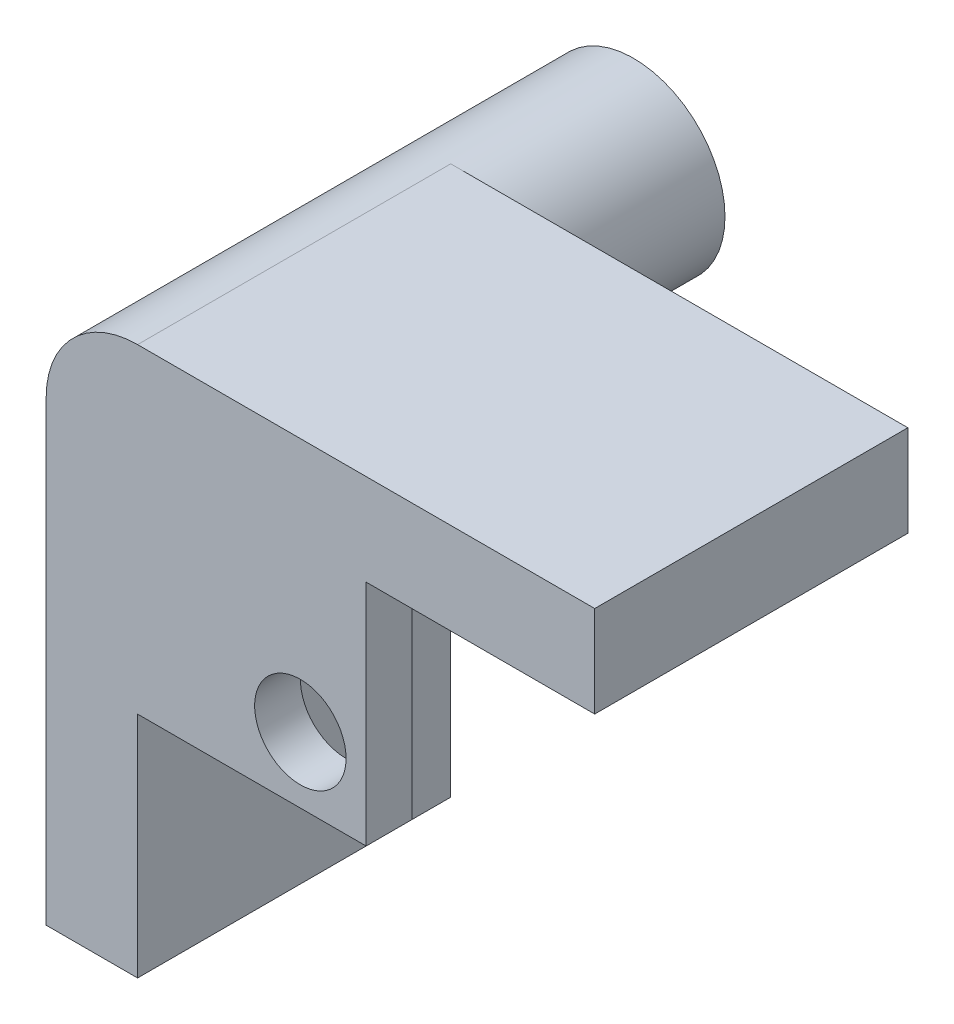
ISO-10303-21;
HEADER;
FILE_DESCRIPTION(('STEP AP214'),'2;1');
FILE_NAME('part.step','',(''),(''),'','','');
FILE_SCHEMA(('AUTOMOTIVE_DESIGN { 1 0 10303 214 1 1 1 1 }'));
ENDSEC;
DATA;
#1=APPLICATION_CONTEXT('core data for automotive mechanical design processes');
#2=APPLICATION_PROTOCOL_DEFINITION('international standard','automotive_design',2000,#1);
#3=PRODUCT_CONTEXT('',#1,'mechanical');
#4=PRODUCT('Part','Part','',(#3));
#5=PRODUCT_RELATED_PRODUCT_CATEGORY('part','',(#4));
#6=PRODUCT_DEFINITION_FORMATION('','',#4);
#7=PRODUCT_DEFINITION_CONTEXT('part definition',#1,'design');
#8=PRODUCT_DEFINITION('design','',#6,#7);
#9=PRODUCT_DEFINITION_SHAPE('','',#8);
#10=(LENGTH_UNIT() NAMED_UNIT(*) SI_UNIT(.MILLI.,.METRE.));
#11=(NAMED_UNIT(*) PLANE_ANGLE_UNIT() SI_UNIT($,.RADIAN.));
#12=(NAMED_UNIT(*) SI_UNIT($,.STERADIAN.) SOLID_ANGLE_UNIT());
#13=UNCERTAINTY_MEASURE_WITH_UNIT(LENGTH_MEASURE(1.E-05),#10,'distance_accuracy_value','');
#14=(GEOMETRIC_REPRESENTATION_CONTEXT(3) GLOBAL_UNCERTAINTY_ASSIGNED_CONTEXT((#13)) GLOBAL_UNIT_ASSIGNED_CONTEXT((#10,
#11,#12)) REPRESENTATION_CONTEXT('',''));
#15=CARTESIAN_POINT('',(0.,0.,0.));
#16=DIRECTION('',(0.,0.,1.));
#17=DIRECTION('',(1.,0.,0.));
#18=AXIS2_PLACEMENT_3D('',#15,#16,#17);
#19=CARTESIAN_POINT('',(0.,0.,0.));
#20=DIRECTION('',(0.,0.,-1.));
#21=DIRECTION('',(1.,0.,0.));
#22=AXIS2_PLACEMENT_3D('',#19,#20,#21);
#23=PLANE('',#22);
#24=CARTESIAN_POINT('',(-46.,-4.,0.));
#25=DIRECTION('',(0.,0.,1.));
#26=DIRECTION('',(1.,0.,0.));
#27=AXIS2_PLACEMENT_3D('',#24,#25,#26);
#28=CIRCLE('',#27,4.00000000000001);
#29=CARTESIAN_POINT('',(-42.,-4.,0.));
#30=VERTEX_POINT('',#29);
#31=CARTESIAN_POINT('',(-46.,0.,0.));
#32=VERTEX_POINT('',#31);
#33=EDGE_CURVE('E48',#30,#32,#28,.T.);
#34=ORIENTED_EDGE('',*,*,#33,.T.);
#35=DIRECTION('',(-1.,0.,0.));
#36=VECTOR('',#35,1.);
#37=CARTESIAN_POINT('',(0.,0.,0.));
#38=LINE('',#37,#36);
#39=CARTESIAN_POINT('',(-26.,0.,0.));
#40=VERTEX_POINT('',#39);
#41=EDGE_CURVE('E170',#40,#32,#38,.T.);
#42=ORIENTED_EDGE('',*,*,#41,.F.);
#43=DIRECTION('',(0.,1.,0.));
#44=VECTOR('',#43,1.);
#45=CARTESIAN_POINT('',(-26.,0.,0.));
#46=LINE('',#45,#44);
#47=CARTESIAN_POINT('',(-26.,-4.,0.));
#48=VERTEX_POINT('',#47);
#49=EDGE_CURVE('E161',#48,#40,#46,.T.);
#50=ORIENTED_EDGE('',*,*,#49,.F.);
#51=DIRECTION('',(-1.,0.,0.));
#52=VECTOR('',#51,1.);
#53=CARTESIAN_POINT('',(0.,-4.,0.));
#54=LINE('',#53,#52);
#55=EDGE_CURVE('E142',#48,#30,#54,.T.);
#56=ORIENTED_EDGE('',*,*,#55,.T.);
#57=EDGE_LOOP('',(#34,#42,#50,#56));
#58=FACE_BOUND('',#57,.T.);
#59=ADVANCED_FACE('F37',(#58),#23,.T.);
#60=CARTESIAN_POINT('',(-50.,-4.,0.));
#61=VERTEX_POINT('',#60);
#62=CARTESIAN_POINT('',(-46.,-8.00000000000001,0.));
#63=VERTEX_POINT('',#62);
#64=EDGE_CURVE('E11',#61,#63,#28,.T.);
#65=ORIENTED_EDGE('',*,*,#64,.T.);
#66=DIRECTION('',(0.,1.,0.));
#67=VECTOR('',#66,1.);
#68=CARTESIAN_POINT('',(-46.,0.,0.));
#69=LINE('',#68,#67);
#70=CARTESIAN_POINT('',(-46.,-24.,0.));
#71=VERTEX_POINT('',#70);
#72=EDGE_CURVE('E166',#71,#63,#69,.T.);
#73=ORIENTED_EDGE('',*,*,#72,.F.);
#74=DIRECTION('',(-1.,0.,0.));
#75=VECTOR('',#74,1.);
#76=CARTESIAN_POINT('',(0.,-24.,0.));
#77=LINE('',#76,#75);
#78=CARTESIAN_POINT('',(-50.,-24.,0.));
#79=VERTEX_POINT('',#78);
#80=EDGE_CURVE('E157',#71,#79,#77,.T.);
#81=ORIENTED_EDGE('',*,*,#80,.T.);
#82=DIRECTION('',(0.,1.,0.));
#83=VECTOR('',#82,1.);
#84=CARTESIAN_POINT('',(-50.,0.,0.));
#85=LINE('',#84,#83);
#86=EDGE_CURVE('E158',#79,#61,#85,.T.);
#87=ORIENTED_EDGE('',*,*,#86,.T.);
#88=EDGE_LOOP('',(#65,#73,#81,#87));
#89=FACE_BOUND('',#88,.T.);
#90=ADVANCED_FACE('F236',(#89),#23,.T.);
#91=CARTESIAN_POINT('',(-46.,-4.,45.6411254969543));
#92=DIRECTION('',(0.,0.,-1.));
#93=DIRECTION('',(1.,0.,0.));
#94=AXIS2_PLACEMENT_3D('',#91,#92,#93);
#95=CYLINDRICAL_SURFACE('',#94,4.00000000000001);
#96=DIRECTION('',(0.,0.,-1.));
#97=VECTOR('',#96,1.);
#98=CARTESIAN_POINT('',(-46.,0.,45.6411254969543));
#99=LINE('',#98,#97);
#100=CARTESIAN_POINT('',(-46.,0.,13.7));
#101=VERTEX_POINT('',#100);
#102=EDGE_CURVE('E41',#101,#32,#99,.T.);
#103=ORIENTED_EDGE('',*,*,#102,.T.);
#104=ORIENTED_EDGE('',*,*,#33,.F.);
#105=DIRECTION('',(0.,0.,-1.));
#106=VECTOR('',#105,1.);
#107=CARTESIAN_POINT('',(-42.,-4.,45.6411254969543));
#108=LINE('',#107,#106);
#109=CARTESIAN_POINT('',(-42.,-4.,11.7));
#110=VERTEX_POINT('',#109);
#111=EDGE_CURVE('E144',#110,#30,#108,.T.);
#112=ORIENTED_EDGE('',*,*,#111,.F.);
#113=CARTESIAN_POINT('',(-46.,-4.,11.7));
#114=DIRECTION('',(0.,0.,-1.));
#115=DIRECTION('',(0.,1.,0.));
#116=AXIS2_PLACEMENT_3D('',#113,#114,#115);
#117=CIRCLE('',#116,4.00000000000001);
#118=CARTESIAN_POINT('',(-46.,-8.00000000000001,11.7));
#119=VERTEX_POINT('',#118);
#120=EDGE_CURVE('E147',#119,#110,#117,.F.);
#121=ORIENTED_EDGE('',*,*,#120,.F.);
#122=DIRECTION('',(0.,0.,-1.));
#123=VECTOR('',#122,1.);
#124=CARTESIAN_POINT('',(-46.,-8.00000000000001,45.6411254969543));
#125=LINE('',#124,#123);
#126=EDGE_CURVE('E152',#119,#63,#125,.T.);
#127=ORIENTED_EDGE('',*,*,#126,.T.);
#128=ORIENTED_EDGE('',*,*,#64,.F.);
#129=DIRECTION('',(0.,0.,-1.));
#130=VECTOR('',#129,1.);
#131=CARTESIAN_POINT('',(-50.,-4.,45.6411254969543));
#132=LINE('',#131,#130);
#133=CARTESIAN_POINT('',(-50.,-4.,13.7));
#134=VERTEX_POINT('',#133);
#135=EDGE_CURVE('E160',#134,#61,#132,.T.);
#136=ORIENTED_EDGE('',*,*,#135,.F.);
#137=CARTESIAN_POINT('',(-46.,-4.,13.7));
#138=DIRECTION('',(0.,0.,-1.));
#139=DIRECTION('',(0.,1.,0.));
#140=AXIS2_PLACEMENT_3D('',#137,#138,#139);
#141=CIRCLE('',#140,4.00000000000001);
#142=EDGE_CURVE('E206',#134,#101,#141,.T.);
#143=ORIENTED_EDGE('',*,*,#142,.T.);
#144=EDGE_LOOP('',(#103,#104,#112,#121,#127,#128,#136,#143));
#145=FACE_BOUND('',#144,.T.);
#146=CARTESIAN_POINT('',(-46.,-4.,-8.));
#147=DIRECTION('',(0.,0.,1.));
#148=DIRECTION('',(1.,0.,0.));
#149=AXIS2_PLACEMENT_3D('',#146,#147,#148);
#150=CIRCLE('',#149,4.00000000000001);
#151=CARTESIAN_POINT('',(-42.,-4.,-8.));
#152=VERTEX_POINT('',#151);
#153=EDGE_CURVE('E180',#152,#152,#150,.T.);
#154=ORIENTED_EDGE('',*,*,#153,.T.);
#155=EDGE_LOOP('',(#154));
#156=FACE_BOUND('',#155,.T.);
#157=ADVANCED_FACE('F39',(#145,#156),#95,.T.);
#158=CARTESIAN_POINT('',(-50.,0.,45.6411254969543));
#159=DIRECTION('',(1.,0.,0.));
#160=DIRECTION('',(0.,0.,1.));
#161=AXIS2_PLACEMENT_3D('',#158,#159,#160);
#162=PLANE('',#161);
#163=ORIENTED_EDGE('',*,*,#135,.T.);
#164=ORIENTED_EDGE('',*,*,#86,.F.);
#165=DIRECTION('',(0.,0.,-1.));
#166=VECTOR('',#165,1.);
#167=CARTESIAN_POINT('',(-50.,-24.,45.6411254969543));
#168=LINE('',#167,#166);
#169=CARTESIAN_POINT('',(-50.,-24.,13.7));
#170=VERTEX_POINT('',#169);
#171=EDGE_CURVE('E159',#170,#79,#168,.T.);
#172=ORIENTED_EDGE('',*,*,#171,.F.);
#173=DIRECTION('',(0.,-1.,0.));
#174=VECTOR('',#173,1.);
#175=CARTESIAN_POINT('',(-50.,0.,13.7));
#176=LINE('',#175,#174);
#177=EDGE_CURVE('E210',#134,#170,#176,.T.);
#178=ORIENTED_EDGE('',*,*,#177,.F.);
#179=EDGE_LOOP('',(#163,#164,#172,#178));
#180=FACE_BOUND('',#179,.T.);
#181=ADVANCED_FACE('F250',(#180),#162,.F.);
#182=CARTESIAN_POINT('',(0.,-24.,45.6411254969543));
#183=DIRECTION('',(0.,1.,0.));
#184=DIRECTION('',(0.,0.,-1.));
#185=AXIS2_PLACEMENT_3D('',#182,#183,#184);
#186=PLANE('',#185);
#187=ORIENTED_EDGE('',*,*,#171,.T.);
#188=ORIENTED_EDGE('',*,*,#80,.F.);
#189=DIRECTION('',(0.,0.,-1.));
#190=VECTOR('',#189,1.);
#191=CARTESIAN_POINT('',(-46.,-24.,45.6411254969543));
#192=LINE('',#191,#190);
#193=CARTESIAN_POINT('',(-46.,-24.,13.7));
#194=VERTEX_POINT('',#193);
#195=EDGE_CURVE('E155',#194,#71,#192,.T.);
#196=ORIENTED_EDGE('',*,*,#195,.F.);
#197=DIRECTION('',(1.,0.,0.));
#198=VECTOR('',#197,1.);
#199=CARTESIAN_POINT('',(0.,-24.,13.7));
#200=LINE('',#199,#198);
#201=EDGE_CURVE('E440',#170,#194,#200,.T.);
#202=ORIENTED_EDGE('',*,*,#201,.F.);
#203=EDGE_LOOP('',(#187,#188,#196,#202));
#204=FACE_BOUND('',#203,.T.);
#205=ADVANCED_FACE('F248',(#204),#186,.F.);
#206=CARTESIAN_POINT('',(-46.,0.,45.6411254969543));
#207=DIRECTION('',(1.,0.,0.));
#208=DIRECTION('',(0.,0.,1.));
#209=AXIS2_PLACEMENT_3D('',#206,#207,#208);
#210=PLANE('',#209);
#211=ORIENTED_EDGE('',*,*,#195,.T.);
#212=ORIENTED_EDGE('',*,*,#72,.T.);
#213=ORIENTED_EDGE('',*,*,#126,.F.);
#214=DIRECTION('',(0.,1.,0.));
#215=VECTOR('',#214,1.);
#216=CARTESIAN_POINT('',(-46.,0.,11.7));
#217=LINE('',#216,#215);
#218=CARTESIAN_POINT('',(-46.,-14.,11.7));
#219=VERTEX_POINT('',#218);
#220=EDGE_CURVE('E154',#219,#119,#217,.T.);
#221=ORIENTED_EDGE('',*,*,#220,.F.);
#222=DIRECTION('',(0.,0.,-1.));
#223=VECTOR('',#222,1.);
#224=CARTESIAN_POINT('',(-46.,-14.,13.7));
#225=LINE('',#224,#223);
#226=CARTESIAN_POINT('',(-46.,-14.,13.7));
#227=VERTEX_POINT('',#226);
#228=EDGE_CURVE('E205',#227,#219,#225,.T.);
#229=ORIENTED_EDGE('',*,*,#228,.F.);
#230=DIRECTION('',(0.,-1.,0.));
#231=VECTOR('',#230,1.);
#232=CARTESIAN_POINT('',(-46.,0.,13.7));
#233=LINE('',#232,#231);
#234=EDGE_CURVE('E438',#227,#194,#233,.T.);
#235=ORIENTED_EDGE('',*,*,#234,.T.);
#236=EDGE_LOOP('',(#211,#212,#213,#221,#229,#235));
#237=FACE_BOUND('',#236,.T.);
#238=ADVANCED_FACE('F195',(#237),#210,.T.);
#239=CARTESIAN_POINT('',(0.,-4.,45.6411254969543));
#240=DIRECTION('',(0.,1.,0.));
#241=DIRECTION('',(-1.,0.,0.));
#242=AXIS2_PLACEMENT_3D('',#239,#240,#241);
#243=PLANE('',#242);
#244=DIRECTION('',(-1.,0.,0.));
#245=VECTOR('',#244,1.);
#246=CARTESIAN_POINT('',(0.,-4.,11.7));
#247=LINE('',#246,#245);
#248=CARTESIAN_POINT('',(-36.,-4.,11.7));
#249=VERTEX_POINT('',#248);
#250=EDGE_CURVE('E178',#249,#110,#247,.T.);
#251=ORIENTED_EDGE('',*,*,#250,.T.);
#252=ORIENTED_EDGE('',*,*,#111,.T.);
#253=ORIENTED_EDGE('',*,*,#55,.F.);
#254=DIRECTION('',(0.,0.,-1.));
#255=VECTOR('',#254,1.);
#256=CARTESIAN_POINT('',(-26.,-4.,45.6411254969543));
#257=LINE('',#256,#255);
#258=CARTESIAN_POINT('',(-26.,-4.,13.7));
#259=VERTEX_POINT('',#258);
#260=EDGE_CURVE('E123',#259,#48,#257,.T.);
#261=ORIENTED_EDGE('',*,*,#260,.F.);
#262=DIRECTION('',(1.,0.,0.));
#263=VECTOR('',#262,1.);
#264=CARTESIAN_POINT('',(0.,-4.,13.7));
#265=LINE('',#264,#263);
#266=CARTESIAN_POINT('',(-36.,-4.,13.7));
#267=VERTEX_POINT('',#266);
#268=EDGE_CURVE('E127',#267,#259,#265,.T.);
#269=ORIENTED_EDGE('',*,*,#268,.F.);
#270=DIRECTION('',(0.,0.,-1.));
#271=VECTOR('',#270,1.);
#272=CARTESIAN_POINT('',(-36.,-4.,13.7));
#273=LINE('',#272,#271);
#274=EDGE_CURVE('E219',#267,#249,#273,.T.);
#275=ORIENTED_EDGE('',*,*,#274,.T.);
#276=EDGE_LOOP('',(#251,#252,#253,#261,#269,#275));
#277=FACE_BOUND('',#276,.T.);
#278=ADVANCED_FACE('F140',(#277),#243,.F.);
#279=CARTESIAN_POINT('',(-26.,0.,45.6411254969543));
#280=DIRECTION('',(1.,0.,0.));
#281=DIRECTION('',(0.,0.,1.));
#282=AXIS2_PLACEMENT_3D('',#279,#280,#281);
#283=PLANE('',#282);
#284=ORIENTED_EDGE('',*,*,#260,.T.);
#285=ORIENTED_EDGE('',*,*,#49,.T.);
#286=DIRECTION('',(0.,0.,-1.));
#287=VECTOR('',#286,1.);
#288=CARTESIAN_POINT('',(-26.,0.,45.6411254969543));
#289=LINE('',#288,#287);
#290=CARTESIAN_POINT('',(-26.,0.,13.7));
#291=VERTEX_POINT('',#290);
#292=EDGE_CURVE('E125',#291,#40,#289,.T.);
#293=ORIENTED_EDGE('',*,*,#292,.F.);
#294=DIRECTION('',(0.,-1.,0.));
#295=VECTOR('',#294,1.);
#296=CARTESIAN_POINT('',(-26.,0.,13.7));
#297=LINE('',#296,#295);
#298=EDGE_CURVE('E118',#291,#259,#297,.T.);
#299=ORIENTED_EDGE('',*,*,#298,.T.);
#300=EDGE_LOOP('',(#284,#285,#293,#299));
#301=FACE_BOUND('',#300,.T.);
#302=ADVANCED_FACE('F120',(#301),#283,.T.);
#303=CARTESIAN_POINT('',(0.,0.,45.6411254969543));
#304=DIRECTION('',(0.,1.,0.));
#305=DIRECTION('',(-1.,0.,0.));
#306=AXIS2_PLACEMENT_3D('',#303,#304,#305);
#307=PLANE('',#306);
#308=ORIENTED_EDGE('',*,*,#292,.T.);
#309=ORIENTED_EDGE('',*,*,#41,.T.);
#310=ORIENTED_EDGE('',*,*,#102,.F.);
#311=DIRECTION('',(1.,0.,0.));
#312=VECTOR('',#311,1.);
#313=CARTESIAN_POINT('',(0.,0.,13.7));
#314=LINE('',#313,#312);
#315=EDGE_CURVE('E203',#101,#291,#314,.T.);
#316=ORIENTED_EDGE('',*,*,#315,.T.);
#317=EDGE_LOOP('',(#308,#309,#310,#316));
#318=FACE_BOUND('',#317,.T.);
#319=ADVANCED_FACE('F202',(#318),#307,.T.);
#320=CARTESIAN_POINT('',(0.,0.,-8.));
#321=DIRECTION('',(0.,0.,-1.));
#322=DIRECTION('',(1.,0.,0.));
#323=AXIS2_PLACEMENT_3D('',#320,#321,#322);
#324=PLANE('',#323);
#325=ORIENTED_EDGE('',*,*,#153,.F.);
#326=EDGE_LOOP('',(#325));
#327=FACE_BOUND('',#326,.T.);
#328=ADVANCED_FACE('F223',(#327),#324,.T.);
#329=CARTESIAN_POINT('',(-46.,-4.,11.7));
#330=DIRECTION('',(0.,0.,1.));
#331=DIRECTION('',(0.,1.,0.));
#332=AXIS2_PLACEMENT_3D('',#329,#330,#331);
#333=PLANE('',#332);
#334=CARTESIAN_POINT('',(-38.8786796564404,-11.1213203435596,11.7));
#335=DIRECTION('',(0.,0.,-1.));
#336=DIRECTION('',(0.,1.,0.));
#337=AXIS2_PLACEMENT_3D('',#334,#335,#336);
#338=CIRCLE('',#337,2.);
#339=CARTESIAN_POINT('',(-36.8786796564404,-11.1213203435596,11.7));
#340=VERTEX_POINT('',#339);
#341=EDGE_CURVE('E431',#340,#340,#338,.T.);
#342=ORIENTED_EDGE('',*,*,#341,.F.);
#343=EDGE_LOOP('',(#342));
#344=FACE_BOUND('',#343,.T.);
#345=DIRECTION('',(0.,1.,0.));
#346=VECTOR('',#345,1.);
#347=CARTESIAN_POINT('',(-36.,0.,11.7));
#348=LINE('',#347,#346);
#349=CARTESIAN_POINT('',(-36.,-14.,11.7));
#350=VERTEX_POINT('',#349);
#351=EDGE_CURVE('E214',#350,#249,#348,.T.);
#352=ORIENTED_EDGE('',*,*,#351,.F.);
#353=DIRECTION('',(-1.,0.,0.));
#354=VECTOR('',#353,1.);
#355=CARTESIAN_POINT('',(0.,-14.,11.7));
#356=LINE('',#355,#354);
#357=EDGE_CURVE('E128',#350,#219,#356,.T.);
#358=ORIENTED_EDGE('',*,*,#357,.T.);
#359=ORIENTED_EDGE('',*,*,#220,.T.);
#360=ORIENTED_EDGE('',*,*,#120,.T.);
#361=ORIENTED_EDGE('',*,*,#250,.F.);
#362=EDGE_LOOP('',(#352,#358,#359,#360,#361));
#363=FACE_BOUND('',#362,.T.);
#364=ADVANCED_FACE('F187',(#344,#363),#333,.F.);
#365=CARTESIAN_POINT('',(-46.,-4.,13.7));
#366=DIRECTION('',(0.,0.,1.));
#367=DIRECTION('',(0.,1.,0.));
#368=AXIS2_PLACEMENT_3D('',#365,#366,#367);
#369=PLANE('',#368);
#370=ORIENTED_EDGE('',*,*,#298,.F.);
#371=ORIENTED_EDGE('',*,*,#315,.F.);
#372=ORIENTED_EDGE('',*,*,#142,.F.);
#373=ORIENTED_EDGE('',*,*,#177,.T.);
#374=ORIENTED_EDGE('',*,*,#201,.T.);
#375=ORIENTED_EDGE('',*,*,#234,.F.);
#376=DIRECTION('',(-1.,0.,0.));
#377=VECTOR('',#376,1.);
#378=CARTESIAN_POINT('',(0.,-14.,13.7));
#379=LINE('',#378,#377);
#380=CARTESIAN_POINT('',(-36.,-14.,13.7));
#381=VERTEX_POINT('',#380);
#382=EDGE_CURVE('E436',#381,#227,#379,.T.);
#383=ORIENTED_EDGE('',*,*,#382,.F.);
#384=DIRECTION('',(0.,1.,0.));
#385=VECTOR('',#384,1.);
#386=CARTESIAN_POINT('',(-36.,0.,13.7));
#387=LINE('',#386,#385);
#388=EDGE_CURVE('E135',#381,#267,#387,.T.);
#389=ORIENTED_EDGE('',*,*,#388,.T.);
#390=ORIENTED_EDGE('',*,*,#268,.T.);
#391=EDGE_LOOP('',(#370,#371,#372,#373,#374,#375,#383,#389,#390));
#392=FACE_BOUND('',#391,.T.);
#393=CARTESIAN_POINT('',(-38.8786796564404,-11.1213203435596,13.7));
#394=DIRECTION('',(0.,0.,-1.));
#395=DIRECTION('',(0.,1.,0.));
#396=AXIS2_PLACEMENT_3D('',#393,#394,#395);
#397=CIRCLE('',#396,2.);
#398=CARTESIAN_POINT('',(-36.8786796564404,-11.1213203435596,13.7));
#399=VERTEX_POINT('',#398);
#400=EDGE_CURVE('E216',#399,#399,#397,.T.);
#401=ORIENTED_EDGE('',*,*,#400,.T.);
#402=EDGE_LOOP('',(#401));
#403=FACE_BOUND('',#402,.T.);
#404=ADVANCED_FACE('F131',(#392,#403),#369,.T.);
#405=CARTESIAN_POINT('',(-36.,0.,13.7));
#406=DIRECTION('',(1.,0.,0.));
#407=DIRECTION('',(0.,0.,1.));
#408=AXIS2_PLACEMENT_3D('',#405,#406,#407);
#409=PLANE('',#408);
#410=ORIENTED_EDGE('',*,*,#351,.T.);
#411=ORIENTED_EDGE('',*,*,#274,.F.);
#412=ORIENTED_EDGE('',*,*,#388,.F.);
#413=DIRECTION('',(0.,0.,-1.));
#414=VECTOR('',#413,1.);
#415=CARTESIAN_POINT('',(-36.,-14.,13.7));
#416=LINE('',#415,#414);
#417=EDGE_CURVE('E208',#381,#350,#416,.T.);
#418=ORIENTED_EDGE('',*,*,#417,.T.);
#419=EDGE_LOOP('',(#410,#411,#412,#418));
#420=FACE_BOUND('',#419,.T.);
#421=ADVANCED_FACE('F385',(#420),#409,.T.);
#422=CARTESIAN_POINT('',(0.,-14.,13.7));
#423=DIRECTION('',(0.,1.,0.));
#424=DIRECTION('',(-1.,0.,0.));
#425=AXIS2_PLACEMENT_3D('',#422,#423,#424);
#426=PLANE('',#425);
#427=ORIENTED_EDGE('',*,*,#357,.F.);
#428=ORIENTED_EDGE('',*,*,#417,.F.);
#429=ORIENTED_EDGE('',*,*,#382,.T.);
#430=ORIENTED_EDGE('',*,*,#228,.T.);
#431=EDGE_LOOP('',(#427,#428,#429,#430));
#432=FACE_BOUND('',#431,.T.);
#433=ADVANCED_FACE('F402',(#432),#426,.F.);
#434=CARTESIAN_POINT('',(-38.8786796564404,-11.1213203435596,13.7));
#435=DIRECTION('',(0.,0.,-1.));
#436=DIRECTION('',(1.,0.,0.));
#437=AXIS2_PLACEMENT_3D('',#434,#435,#436);
#438=CYLINDRICAL_SURFACE('',#437,2.);
#439=CARTESIAN_POINT('',(-36.8786796564404,-11.1213203435596,13.7));
#440=CARTESIAN_POINT('',(-36.8786796564404,-11.1213203435596,13.6791666666667));
#441=CARTESIAN_POINT('',(-36.8786796564404,-11.1213203435596,13.6583333333333));
#442=CARTESIAN_POINT('',(-36.8786796564404,-11.1213203435596,13.6166666666667));
#443=CARTESIAN_POINT('',(-36.8786796564404,-11.1213203435596,13.5958333333333));
#444=CARTESIAN_POINT('',(-36.8786796564404,-11.1213203435596,13.5541666666667));
#445=CARTESIAN_POINT('',(-36.8786796564404,-11.1213203435596,13.5333333333333));
#446=CARTESIAN_POINT('',(-36.8786796564404,-11.1213203435596,13.4916666666667));
#447=CARTESIAN_POINT('',(-36.8786796564404,-11.1213203435596,13.4708333333333));
#448=CARTESIAN_POINT('',(-36.8786796564404,-11.1213203435596,13.4291666666667));
#449=CARTESIAN_POINT('',(-36.8786796564404,-11.1213203435596,13.4083333333333));
#450=CARTESIAN_POINT('',(-36.8786796564404,-11.1213203435596,13.3666666666667));
#451=CARTESIAN_POINT('',(-36.8786796564404,-11.1213203435596,13.3458333333333));
#452=CARTESIAN_POINT('',(-36.8786796564404,-11.1213203435596,13.3041666666667));
#453=CARTESIAN_POINT('',(-36.8786796564404,-11.1213203435596,13.2833333333333));
#454=CARTESIAN_POINT('',(-36.8786796564404,-11.1213203435596,13.2416666666667));
#455=CARTESIAN_POINT('',(-36.8786796564404,-11.1213203435596,13.2208333333333));
#456=CARTESIAN_POINT('',(-36.8786796564404,-11.1213203435596,13.1791666666667));
#457=CARTESIAN_POINT('',(-36.8786796564404,-11.1213203435596,13.1583333333333));
#458=CARTESIAN_POINT('',(-36.8786796564404,-11.1213203435596,13.1166666666667));
#459=CARTESIAN_POINT('',(-36.8786796564404,-11.1213203435596,13.0958333333333));
#460=CARTESIAN_POINT('',(-36.8786796564404,-11.1213203435596,13.0541666666667));
#461=CARTESIAN_POINT('',(-36.8786796564404,-11.1213203435596,13.0333333333333));
#462=CARTESIAN_POINT('',(-36.8786796564404,-11.1213203435596,12.9916666666667));
#463=CARTESIAN_POINT('',(-36.8786796564404,-11.1213203435596,12.9708333333333));
#464=CARTESIAN_POINT('',(-36.8786796564404,-11.1213203435596,12.9291666666667));
#465=CARTESIAN_POINT('',(-36.8786796564404,-11.1213203435596,12.9083333333333));
#466=CARTESIAN_POINT('',(-36.8786796564404,-11.1213203435596,12.8666666666667));
#467=CARTESIAN_POINT('',(-36.8786796564404,-11.1213203435596,12.8458333333333));
#468=CARTESIAN_POINT('',(-36.8786796564404,-11.1213203435596,12.8041666666667));
#469=CARTESIAN_POINT('',(-36.8786796564404,-11.1213203435596,12.7833333333333));
#470=CARTESIAN_POINT('',(-36.8786796564404,-11.1213203435596,12.7416666666667));
#471=CARTESIAN_POINT('',(-36.8786796564404,-11.1213203435596,12.7208333333333));
#472=CARTESIAN_POINT('',(-36.8786796564404,-11.1213203435596,12.6791666666667));
#473=CARTESIAN_POINT('',(-36.8786796564404,-11.1213203435596,12.6583333333333));
#474=CARTESIAN_POINT('',(-36.8786796564404,-11.1213203435596,12.6166666666667));
#475=CARTESIAN_POINT('',(-36.8786796564404,-11.1213203435596,12.5958333333333));
#476=CARTESIAN_POINT('',(-36.8786796564404,-11.1213203435596,12.5541666666667));
#477=CARTESIAN_POINT('',(-36.8786796564404,-11.1213203435596,12.5333333333333));
#478=CARTESIAN_POINT('',(-36.8786796564404,-11.1213203435596,12.4916666666667));
#479=CARTESIAN_POINT('',(-36.8786796564404,-11.1213203435596,12.4708333333333));
#480=CARTESIAN_POINT('',(-36.8786796564404,-11.1213203435596,12.4291666666667));
#481=CARTESIAN_POINT('',(-36.8786796564404,-11.1213203435596,12.4083333333333));
#482=CARTESIAN_POINT('',(-36.8786796564404,-11.1213203435596,12.3666666666667));
#483=CARTESIAN_POINT('',(-36.8786796564404,-11.1213203435596,12.3458333333333));
#484=CARTESIAN_POINT('',(-36.8786796564404,-11.1213203435596,12.3041666666667));
#485=CARTESIAN_POINT('',(-36.8786796564404,-11.1213203435596,12.2833333333333));
#486=CARTESIAN_POINT('',(-36.8786796564404,-11.1213203435596,12.2416666666667));
#487=CARTESIAN_POINT('',(-36.8786796564404,-11.1213203435596,12.2208333333333));
#488=CARTESIAN_POINT('',(-36.8786796564404,-11.1213203435596,12.1791666666667));
#489=CARTESIAN_POINT('',(-36.8786796564404,-11.1213203435596,12.1583333333333));
#490=CARTESIAN_POINT('',(-36.8786796564404,-11.1213203435596,12.1166666666667));
#491=CARTESIAN_POINT('',(-36.8786796564404,-11.1213203435596,12.0958333333333));
#492=CARTESIAN_POINT('',(-36.8786796564404,-11.1213203435596,12.0541666666667));
#493=CARTESIAN_POINT('',(-36.8786796564404,-11.1213203435596,12.0333333333333));
#494=CARTESIAN_POINT('',(-36.8786796564404,-11.1213203435596,11.9916666666667));
#495=CARTESIAN_POINT('',(-36.8786796564404,-11.1213203435596,11.9708333333333));
#496=CARTESIAN_POINT('',(-36.8786796564404,-11.1213203435596,11.9291666666667));
#497=CARTESIAN_POINT('',(-36.8786796564404,-11.1213203435596,11.9083333333333));
#498=CARTESIAN_POINT('',(-36.8786796564404,-11.1213203435596,11.8666666666667));
#499=CARTESIAN_POINT('',(-36.8786796564404,-11.1213203435596,11.8458333333333));
#500=CARTESIAN_POINT('',(-36.8786796564404,-11.1213203435596,11.8041666666667));
#501=CARTESIAN_POINT('',(-36.8786796564404,-11.1213203435596,11.7833333333333));
#502=CARTESIAN_POINT('',(-36.8786796564404,-11.1213203435596,11.7416666666667));
#503=CARTESIAN_POINT('',(-36.8786796564404,-11.1213203435596,11.7208333333333));
#504=CARTESIAN_POINT('',(-36.8786796564404,-11.1213203435596,11.7));
#505=B_SPLINE_CURVE_WITH_KNOTS('',3,(#439,#440,#441,#442,#443,#444,#445,#446,#447,#448,#449,
#450,#451,#452,#453,#454,#455,#456,#457,#458,#459,#460,#461,#462,#463,#464,#465,#466,#467,#468,
#469,#470,#471,#472,#473,#474,#475,#476,#477,#478,#479,#480,#481,#482,#483,#484,#485,#486,#487,
#488,#489,#490,#491,#492,#493,#494,#495,#496,#497,#498,#499,#500,#501,#502,#503,#504),
.UNSPECIFIED.,.F.,.F.,(4,2,2,2,2,2,2,2,2,2,2,2,2,2,2,2,2,2,2,2,2,2,2,2,2,2,2,2,2,2,2,2,4),(0.,
0.0624999999999983,0.124999999999998,0.187499999999998,0.249999999999999,0.312499999999999,
0.374999999999999,0.437499999999999,0.499999999999999,0.562499999999999,0.624999999999999,
0.687499999999999,0.749999999999999,0.812499999999999,0.874999999999999,0.937499999999999,
0.999999999999999,1.0625,1.125,1.1875,1.25,1.3125,1.375,1.4375,1.5,1.5625,1.625,1.6875,1.75,
1.8125,1.875,1.9375,2.),.UNSPECIFIED.);
#506=EDGE_CURVE('BSEAM410',#399,#340,#505,.T.);
#507=ORIENTED_EDGE('',*,*,#400,.F.);
#508=ORIENTED_EDGE('',*,*,#341,.T.);
#509=ORIENTED_EDGE('',*,*,#506,.T.);
#510=ORIENTED_EDGE('',*,*,#506,.F.);
#511=EDGE_LOOP('',(#507,#509,#508,#510));
#512=FACE_BOUND('',#511,.T.);
#513=ADVANCED_FACE('F410',(#512),#438,.F.);
#514=CLOSED_SHELL('',(#59,#90,#157,#181,#205,#238,#278,#302,#319,#328,#364,#404,#421,#433,#513));
#515=MANIFOLD_SOLID_BREP('B2',#514);
#516=ADVANCED_BREP_SHAPE_REPRESENTATION('',(#18,#515),#14);
#517=SHAPE_DEFINITION_REPRESENTATION(#9,#516);
ENDSEC;
END-ISO-10303-21;
